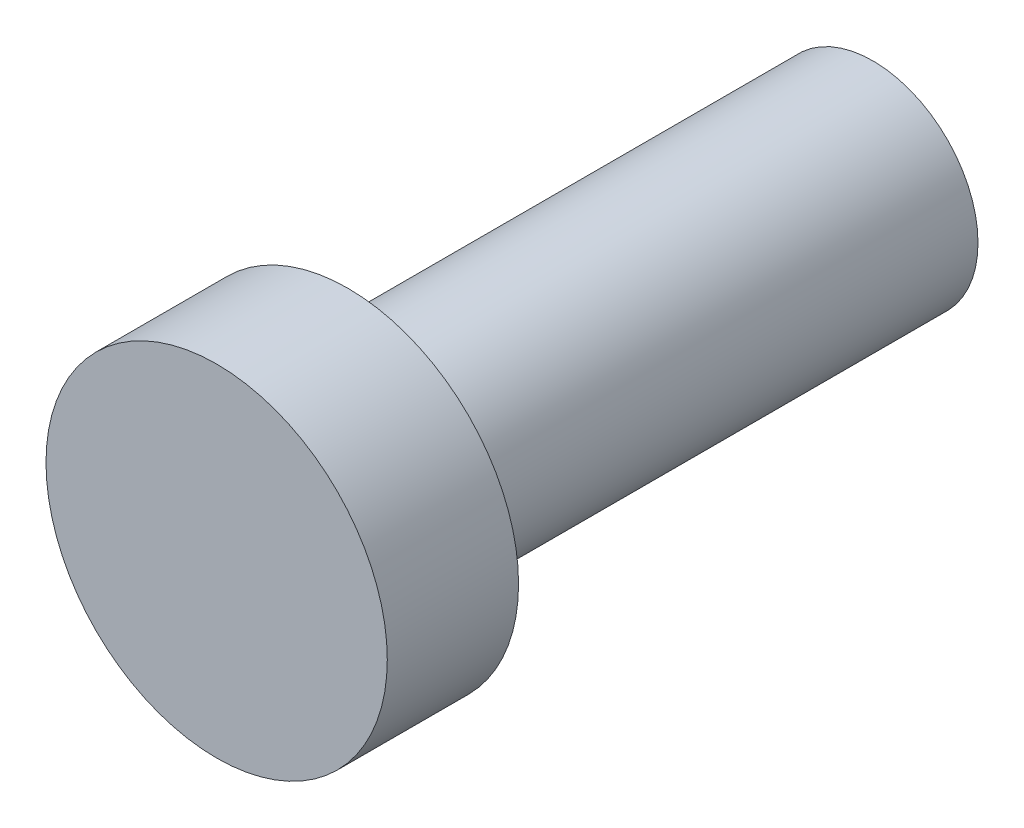
ISO-10303-21;
HEADER;
FILE_DESCRIPTION(('STEP AP214'),'2;1');
FILE_NAME('part.step','',(''),(''),'','','');
FILE_SCHEMA(('AUTOMOTIVE_DESIGN { 1 0 10303 214 1 1 1 1 }'));
ENDSEC;
DATA;
#1=APPLICATION_CONTEXT('core data for automotive mechanical design processes');
#2=APPLICATION_PROTOCOL_DEFINITION('international standard','automotive_design',2000,#1);
#3=PRODUCT_CONTEXT('',#1,'mechanical');
#4=PRODUCT('Part','Part','',(#3));
#5=PRODUCT_RELATED_PRODUCT_CATEGORY('part','',(#4));
#6=PRODUCT_DEFINITION_FORMATION('','',#4);
#7=PRODUCT_DEFINITION_CONTEXT('part definition',#1,'design');
#8=PRODUCT_DEFINITION('design','',#6,#7);
#9=PRODUCT_DEFINITION_SHAPE('','',#8);
#10=(LENGTH_UNIT() NAMED_UNIT(*) SI_UNIT(.MILLI.,.METRE.));
#11=(NAMED_UNIT(*) PLANE_ANGLE_UNIT() SI_UNIT($,.RADIAN.));
#12=(NAMED_UNIT(*) SI_UNIT($,.STERADIAN.) SOLID_ANGLE_UNIT());
#13=UNCERTAINTY_MEASURE_WITH_UNIT(LENGTH_MEASURE(1.E-05),#10,'distance_accuracy_value','');
#14=(GEOMETRIC_REPRESENTATION_CONTEXT(3) GLOBAL_UNCERTAINTY_ASSIGNED_CONTEXT((#13)) GLOBAL_UNIT_ASSIGNED_CONTEXT((#10,
#11,#12)) REPRESENTATION_CONTEXT('',''));
#15=CARTESIAN_POINT('',(0.,0.,0.));
#16=DIRECTION('',(0.,0.,1.));
#17=DIRECTION('',(1.,0.,0.));
#18=AXIS2_PLACEMENT_3D('',#15,#16,#17);
#19=CARTESIAN_POINT('',(0.,0.,20.));
#20=DIRECTION('',(0.,0.,-1.));
#21=DIRECTION('',(-1.,0.,0.));
#22=AXIS2_PLACEMENT_3D('',#19,#20,#21);
#23=CYLINDRICAL_SURFACE('',#22,4.);
#24=CARTESIAN_POINT('',(0.,0.,20.));
#25=DIRECTION('',(0.,0.,1.));
#26=DIRECTION('',(1.,0.,0.));
#27=AXIS2_PLACEMENT_3D('',#24,#25,#26);
#28=CIRCLE('',#27,4.);
#29=CARTESIAN_POINT('',(4.,0.,20.));
#30=VERTEX_POINT('',#29);
#31=EDGE_CURVE('E10',#30,#30,#28,.T.);
#32=ORIENTED_EDGE('',*,*,#31,.F.);
#33=EDGE_LOOP('',(#32));
#34=FACE_BOUND('',#33,.T.);
#35=CARTESIAN_POINT('',(0.,0.,0.));
#36=DIRECTION('',(0.,0.,1.));
#37=DIRECTION('',(1.,0.,0.));
#38=AXIS2_PLACEMENT_3D('',#35,#36,#37);
#39=CIRCLE('',#38,4.);
#40=CARTESIAN_POINT('',(4.,0.,0.));
#41=VERTEX_POINT('',#40);
#42=EDGE_CURVE('E36',#41,#41,#39,.T.);
#43=ORIENTED_EDGE('',*,*,#42,.T.);
#44=EDGE_LOOP('',(#43));
#45=FACE_BOUND('',#44,.T.);
#46=ADVANCED_FACE('F33',(#34,#45),#23,.T.);
#47=CARTESIAN_POINT('',(0.,0.,0.));
#48=DIRECTION('',(0.,0.,1.));
#49=DIRECTION('',(1.,0.,0.));
#50=AXIS2_PLACEMENT_3D('',#47,#48,#49);
#51=PLANE('',#50);
#52=ORIENTED_EDGE('',*,*,#42,.F.);
#53=EDGE_LOOP('',(#52));
#54=FACE_BOUND('',#53,.T.);
#55=ADVANCED_FACE('F56',(#54),#51,.F.);
#56=CARTESIAN_POINT('',(0.,0.,25.));
#57=DIRECTION('',(0.,0.,-1.));
#58=DIRECTION('',(-1.,0.,0.));
#59=AXIS2_PLACEMENT_3D('',#56,#57,#58);
#60=CYLINDRICAL_SURFACE('',#59,6.5);
#61=CARTESIAN_POINT('',(0.,0.,25.));
#62=DIRECTION('',(0.,0.,1.));
#63=DIRECTION('',(1.,0.,0.));
#64=AXIS2_PLACEMENT_3D('',#61,#62,#63);
#65=CIRCLE('',#64,6.5);
#66=CARTESIAN_POINT('',(6.5,0.,25.));
#67=VERTEX_POINT('',#66);
#68=EDGE_CURVE('E43',#67,#67,#65,.T.);
#69=ORIENTED_EDGE('',*,*,#68,.F.);
#70=EDGE_LOOP('',(#69));
#71=FACE_BOUND('',#70,.T.);
#72=CARTESIAN_POINT('',(0.,0.,20.));
#73=DIRECTION('',(0.,0.,1.));
#74=DIRECTION('',(1.,0.,0.));
#75=AXIS2_PLACEMENT_3D('',#72,#73,#74);
#76=CIRCLE('',#75,6.5);
#77=CARTESIAN_POINT('',(6.5,0.,20.));
#78=VERTEX_POINT('',#77);
#79=EDGE_CURVE('E45',#78,#78,#76,.T.);
#80=ORIENTED_EDGE('',*,*,#79,.T.);
#81=EDGE_LOOP('',(#80));
#82=FACE_BOUND('',#81,.T.);
#83=ADVANCED_FACE('F53',(#71,#82),#60,.T.);
#84=CARTESIAN_POINT('',(0.,0.,25.));
#85=DIRECTION('',(0.,0.,1.));
#86=DIRECTION('',(1.,0.,0.));
#87=AXIS2_PLACEMENT_3D('',#84,#85,#86);
#88=PLANE('',#87);
#89=ORIENTED_EDGE('',*,*,#68,.T.);
#90=EDGE_LOOP('',(#89));
#91=FACE_BOUND('',#90,.T.);
#92=ADVANCED_FACE('F51',(#91),#88,.T.);
#93=CARTESIAN_POINT('',(0.,0.,20.));
#94=DIRECTION('',(0.,0.,1.));
#95=DIRECTION('',(1.,0.,0.));
#96=AXIS2_PLACEMENT_3D('',#93,#94,#95);
#97=PLANE('',#96);
#98=ORIENTED_EDGE('',*,*,#31,.T.);
#99=EDGE_LOOP('',(#98));
#100=FACE_BOUND('',#99,.T.);
#101=ORIENTED_EDGE('',*,*,#79,.F.);
#102=EDGE_LOOP('',(#101));
#103=FACE_BOUND('',#102,.T.);
#104=ADVANCED_FACE('F60',(#100,#103),#97,.F.);
#105=CLOSED_SHELL('',(#46,#55,#83,#92,#104));
#106=MANIFOLD_SOLID_BREP('B2',#105);
#107=ADVANCED_BREP_SHAPE_REPRESENTATION('',(#18,#106),#14);
#108=SHAPE_DEFINITION_REPRESENTATION(#9,#107);
ENDSEC;
END-ISO-10303-21;
